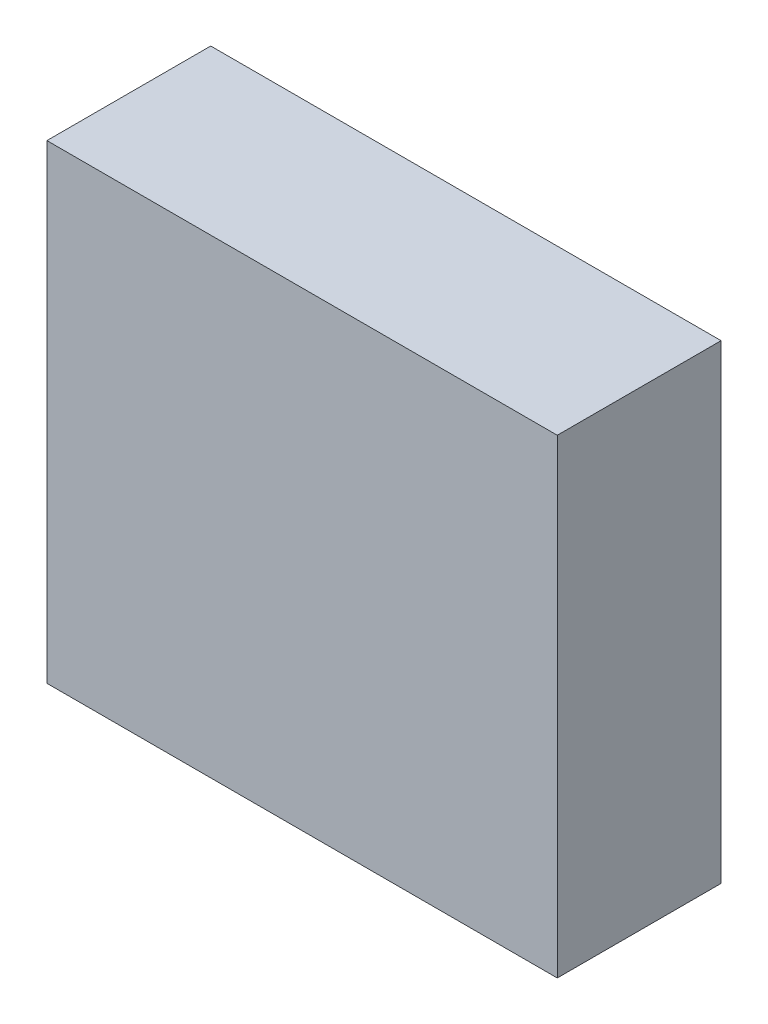
ISO-10303-21;
HEADER;
FILE_DESCRIPTION(('STEP AP214'),'2;1');
FILE_NAME('part.step','',(''),(''),'','','');
FILE_SCHEMA(('AUTOMOTIVE_DESIGN { 1 0 10303 214 1 1 1 1 }'));
ENDSEC;
DATA;
#1=APPLICATION_CONTEXT('core data for automotive mechanical design processes');
#2=APPLICATION_PROTOCOL_DEFINITION('international standard','automotive_design',2000,#1);
#3=PRODUCT_CONTEXT('',#1,'mechanical');
#4=PRODUCT('Part','Part','',(#3));
#5=PRODUCT_RELATED_PRODUCT_CATEGORY('part','',(#4));
#6=PRODUCT_DEFINITION_FORMATION('','',#4);
#7=PRODUCT_DEFINITION_CONTEXT('part definition',#1,'design');
#8=PRODUCT_DEFINITION('design','',#6,#7);
#9=PRODUCT_DEFINITION_SHAPE('','',#8);
#10=(LENGTH_UNIT() NAMED_UNIT(*) SI_UNIT(.MILLI.,.METRE.));
#11=(NAMED_UNIT(*) PLANE_ANGLE_UNIT() SI_UNIT($,.RADIAN.));
#12=(NAMED_UNIT(*) SI_UNIT($,.STERADIAN.) SOLID_ANGLE_UNIT());
#13=UNCERTAINTY_MEASURE_WITH_UNIT(LENGTH_MEASURE(1.E-05),#10,'distance_accuracy_value','');
#14=(GEOMETRIC_REPRESENTATION_CONTEXT(3) GLOBAL_UNCERTAINTY_ASSIGNED_CONTEXT((#13)) GLOBAL_UNIT_ASSIGNED_CONTEXT((#10,
#11,#12)) REPRESENTATION_CONTEXT('',''));
#15=CARTESIAN_POINT('',(0.,0.,0.));
#16=DIRECTION('',(0.,0.,1.));
#17=DIRECTION('',(1.,0.,0.));
#18=AXIS2_PLACEMENT_3D('',#15,#16,#17);
#19=CARTESIAN_POINT('',(-5.125,3.965,3.29));
#20=DIRECTION('',(1.,0.,0.));
#21=DIRECTION('',(0.,0.,-1.));
#22=AXIS2_PLACEMENT_3D('',#19,#20,#21);
#23=PLANE('',#22);
#24=DIRECTION('',(0.,-1.,0.));
#25=VECTOR('',#24,1.);
#26=CARTESIAN_POINT('',(-5.125,3.965,0.));
#27=LINE('',#26,#25);
#28=CARTESIAN_POINT('',(-5.125,3.965,0.));
#29=VERTEX_POINT('',#28);
#30=CARTESIAN_POINT('',(-5.125,-5.475,0.));
#31=VERTEX_POINT('',#30);
#32=EDGE_CURVE('E97',#29,#31,#27,.T.);
#33=ORIENTED_EDGE('',*,*,#32,.T.);
#34=DIRECTION('',(0.,0.,-1.));
#35=VECTOR('',#34,1.);
#36=CARTESIAN_POINT('',(-5.125,-5.475,3.29));
#37=LINE('',#36,#35);
#38=CARTESIAN_POINT('',(-5.125,-5.475,3.29));
#39=VERTEX_POINT('',#38);
#40=EDGE_CURVE('E11',#39,#31,#37,.T.);
#41=ORIENTED_EDGE('',*,*,#40,.F.);
#42=DIRECTION('',(0.,-1.,0.));
#43=VECTOR('',#42,1.);
#44=CARTESIAN_POINT('',(-5.125,3.965,3.29));
#45=LINE('',#44,#43);
#46=CARTESIAN_POINT('',(-5.125,3.965,3.29));
#47=VERTEX_POINT('',#46);
#48=EDGE_CURVE('E85',#47,#39,#45,.T.);
#49=ORIENTED_EDGE('',*,*,#48,.F.);
#50=DIRECTION('',(0.,0.,-1.));
#51=VECTOR('',#50,1.);
#52=CARTESIAN_POINT('',(-5.125,3.965,3.29));
#53=LINE('',#52,#51);
#54=EDGE_CURVE('E93',#47,#29,#53,.T.);
#55=ORIENTED_EDGE('',*,*,#54,.T.);
#56=EDGE_LOOP('',(#33,#41,#49,#55));
#57=FACE_BOUND('',#56,.T.);
#58=ADVANCED_FACE('F34',(#57),#23,.F.);
#59=CARTESIAN_POINT('',(-5.125,-5.475,3.29));
#60=DIRECTION('',(0.,1.,0.));
#61=DIRECTION('',(0.,0.,1.));
#62=AXIS2_PLACEMENT_3D('',#59,#60,#61);
#63=PLANE('',#62);
#64=DIRECTION('',(1.,0.,0.));
#65=VECTOR('',#64,1.);
#66=CARTESIAN_POINT('',(-5.125,-5.475,0.));
#67=LINE('',#66,#65);
#68=CARTESIAN_POINT('',(5.125,-5.475,0.));
#69=VERTEX_POINT('',#68);
#70=EDGE_CURVE('E89',#31,#69,#67,.T.);
#71=ORIENTED_EDGE('',*,*,#70,.T.);
#72=DIRECTION('',(0.,0.,-1.));
#73=VECTOR('',#72,1.);
#74=CARTESIAN_POINT('',(5.125,-5.475,3.29));
#75=LINE('',#74,#73);
#76=CARTESIAN_POINT('',(5.125,-5.475,3.29));
#77=VERTEX_POINT('',#76);
#78=EDGE_CURVE('E42',#77,#69,#75,.T.);
#79=ORIENTED_EDGE('',*,*,#78,.F.);
#80=DIRECTION('',(1.,0.,0.));
#81=VECTOR('',#80,1.);
#82=CARTESIAN_POINT('',(-5.125,-5.475,3.29));
#83=LINE('',#82,#81);
#84=EDGE_CURVE('E80',#39,#77,#83,.T.);
#85=ORIENTED_EDGE('',*,*,#84,.F.);
#86=ORIENTED_EDGE('',*,*,#40,.T.);
#87=EDGE_LOOP('',(#71,#79,#85,#86));
#88=FACE_BOUND('',#87,.T.);
#89=ADVANCED_FACE('F88',(#88),#63,.F.);
#90=CARTESIAN_POINT('',(5.125,-5.475,3.29));
#91=DIRECTION('',(-1.,0.,0.));
#92=DIRECTION('',(0.,0.,1.));
#93=AXIS2_PLACEMENT_3D('',#90,#91,#92);
#94=PLANE('',#93);
#95=DIRECTION('',(0.,1.,0.));
#96=VECTOR('',#95,1.);
#97=CARTESIAN_POINT('',(5.125,-5.475,0.));
#98=LINE('',#97,#96);
#99=CARTESIAN_POINT('',(5.125,3.965,0.));
#100=VERTEX_POINT('',#99);
#101=EDGE_CURVE('E67',#69,#100,#98,.T.);
#102=ORIENTED_EDGE('',*,*,#101,.T.);
#103=DIRECTION('',(0.,0.,-1.));
#104=VECTOR('',#103,1.);
#105=CARTESIAN_POINT('',(5.125,3.965,3.29));
#106=LINE('',#105,#104);
#107=CARTESIAN_POINT('',(5.125,3.965,3.29));
#108=VERTEX_POINT('',#107);
#109=EDGE_CURVE('E90',#108,#100,#106,.T.);
#110=ORIENTED_EDGE('',*,*,#109,.F.);
#111=DIRECTION('',(0.,1.,0.));
#112=VECTOR('',#111,1.);
#113=CARTESIAN_POINT('',(5.125,-5.475,3.29));
#114=LINE('',#113,#112);
#115=EDGE_CURVE('E83',#77,#108,#114,.T.);
#116=ORIENTED_EDGE('',*,*,#115,.F.);
#117=ORIENTED_EDGE('',*,*,#78,.T.);
#118=EDGE_LOOP('',(#102,#110,#116,#117));
#119=FACE_BOUND('',#118,.T.);
#120=ADVANCED_FACE('F91',(#119),#94,.F.);
#121=CARTESIAN_POINT('',(5.125,3.965,3.29));
#122=DIRECTION('',(0.,-1.,0.));
#123=DIRECTION('',(0.,0.,-1.));
#124=AXIS2_PLACEMENT_3D('',#121,#122,#123);
#125=PLANE('',#124);
#126=DIRECTION('',(-1.,0.,0.));
#127=VECTOR('',#126,1.);
#128=CARTESIAN_POINT('',(5.125,3.965,0.));
#129=LINE('',#128,#127);
#130=EDGE_CURVE('E73',#100,#29,#129,.T.);
#131=ORIENTED_EDGE('',*,*,#130,.T.);
#132=ORIENTED_EDGE('',*,*,#54,.F.);
#133=DIRECTION('',(-1.,0.,0.));
#134=VECTOR('',#133,1.);
#135=CARTESIAN_POINT('',(5.125,3.965,3.29));
#136=LINE('',#135,#134);
#137=EDGE_CURVE('E50',#108,#47,#136,.T.);
#138=ORIENTED_EDGE('',*,*,#137,.F.);
#139=ORIENTED_EDGE('',*,*,#109,.T.);
#140=EDGE_LOOP('',(#131,#132,#138,#139));
#141=FACE_BOUND('',#140,.T.);
#142=ADVANCED_FACE('F104',(#141),#125,.F.);
#143=CARTESIAN_POINT('',(0.,0.,3.29));
#144=DIRECTION('',(0.,0.,1.));
#145=DIRECTION('',(1.,0.,0.));
#146=AXIS2_PLACEMENT_3D('',#143,#144,#145);
#147=PLANE('',#146);
#148=ORIENTED_EDGE('',*,*,#48,.T.);
#149=ORIENTED_EDGE('',*,*,#84,.T.);
#150=ORIENTED_EDGE('',*,*,#115,.T.);
#151=ORIENTED_EDGE('',*,*,#137,.T.);
#152=EDGE_LOOP('',(#148,#149,#150,#151));
#153=FACE_BOUND('',#152,.T.);
#154=ADVANCED_FACE('F81',(#153),#147,.T.);
#155=CARTESIAN_POINT('',(0.,0.,0.));
#156=DIRECTION('',(0.,0.,1.));
#157=DIRECTION('',(1.,0.,0.));
#158=AXIS2_PLACEMENT_3D('',#155,#156,#157);
#159=PLANE('',#158);
#160=ORIENTED_EDGE('',*,*,#32,.F.);
#161=ORIENTED_EDGE('',*,*,#130,.F.);
#162=ORIENTED_EDGE('',*,*,#101,.F.);
#163=ORIENTED_EDGE('',*,*,#70,.F.);
#164=EDGE_LOOP('',(#160,#161,#162,#163));
#165=FACE_BOUND('',#164,.T.);
#166=ADVANCED_FACE('F107',(#165),#159,.F.);
#167=CLOSED_SHELL('',(#58,#89,#120,#142,#154,#166));
#168=MANIFOLD_SOLID_BREP('B2',#167);
#169=ADVANCED_BREP_SHAPE_REPRESENTATION('',(#18,#168),#14);
#170=SHAPE_DEFINITION_REPRESENTATION(#9,#169);
ENDSEC;
END-ISO-10303-21;
